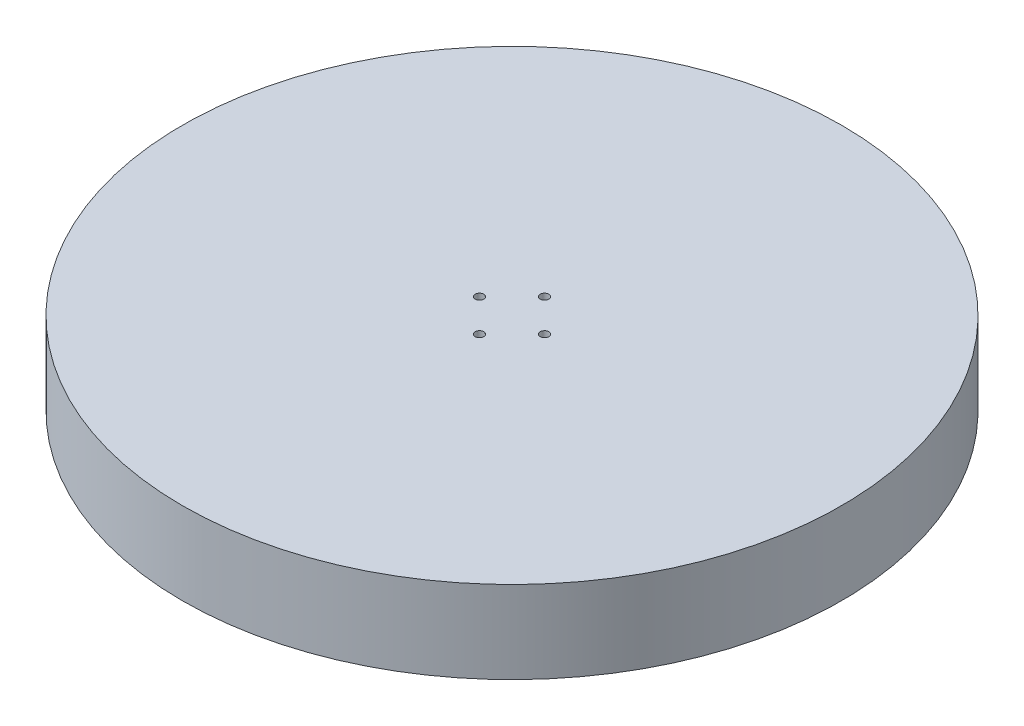
ISO-10303-21;
HEADER;
FILE_DESCRIPTION(('STEP AP214'),'2;1');
FILE_NAME('part.step','',(''),(''),'','','');
FILE_SCHEMA(('AUTOMOTIVE_DESIGN { 1 0 10303 214 1 1 1 1 }'));
ENDSEC;
DATA;
#1=APPLICATION_CONTEXT('core data for automotive mechanical design processes');
#2=APPLICATION_PROTOCOL_DEFINITION('international standard','automotive_design',2000,#1);
#3=PRODUCT_CONTEXT('',#1,'mechanical');
#4=PRODUCT('Part','Part','',(#3));
#5=PRODUCT_RELATED_PRODUCT_CATEGORY('part','',(#4));
#6=PRODUCT_DEFINITION_FORMATION('','',#4);
#7=PRODUCT_DEFINITION_CONTEXT('part definition',#1,'design');
#8=PRODUCT_DEFINITION('design','',#6,#7);
#9=PRODUCT_DEFINITION_SHAPE('','',#8);
#10=(LENGTH_UNIT() NAMED_UNIT(*) SI_UNIT(.MILLI.,.METRE.));
#11=(NAMED_UNIT(*) PLANE_ANGLE_UNIT() SI_UNIT($,.RADIAN.));
#12=(NAMED_UNIT(*) SI_UNIT($,.STERADIAN.) SOLID_ANGLE_UNIT());
#13=UNCERTAINTY_MEASURE_WITH_UNIT(LENGTH_MEASURE(1.E-05),#10,'distance_accuracy_value','');
#14=(GEOMETRIC_REPRESENTATION_CONTEXT(3) GLOBAL_UNCERTAINTY_ASSIGNED_CONTEXT((#13)) GLOBAL_UNIT_ASSIGNED_CONTEXT((#10,
#11,#12)) REPRESENTATION_CONTEXT('',''));
#15=CARTESIAN_POINT('',(0.,0.,0.));
#16=DIRECTION('',(0.,0.,1.));
#17=DIRECTION('',(1.,0.,0.));
#18=AXIS2_PLACEMENT_3D('',#15,#16,#17);
#19=CARTESIAN_POINT('',(0.,4.,0.));
#20=DIRECTION('',(0.,1.,0.));
#21=DIRECTION('',(0.,0.,1.));
#22=AXIS2_PLACEMENT_3D('',#19,#20,#21);
#23=PLANE('',#22);
#24=CARTESIAN_POINT('',(15.0000000000004,4.,4.24488671257339E-13));
#25=DIRECTION('',(0.,1.,0.));
#26=DIRECTION('',(0.,0.,1.));
#27=AXIS2_PLACEMENT_3D('',#24,#25,#26);
#28=CIRCLE('',#27,2.00000000000033);
#29=CARTESIAN_POINT('',(15.0000000000004,4.,2.00000000000076));
#30=VERTEX_POINT('',#29);
#31=EDGE_CURVE('E127',#30,#30,#28,.T.);
#32=ORIENTED_EDGE('',*,*,#31,.F.);
#33=EDGE_LOOP('',(#32));
#34=FACE_BOUND('',#33,.T.);
#35=CARTESIAN_POINT('',(8.48977342514678E-13,4.,-15.));
#36=DIRECTION('',(0.,1.,0.));
#37=DIRECTION('',(0.,0.,1.));
#38=AXIS2_PLACEMENT_3D('',#35,#36,#37);
#39=CIRCLE('',#38,2.00000000000091);
#40=CARTESIAN_POINT('',(8.48977342514678E-13,4.,-12.9999999999991));
#41=VERTEX_POINT('',#40);
#42=EDGE_CURVE('E121',#41,#41,#39,.T.);
#43=ORIENTED_EDGE('',*,*,#42,.F.);
#44=EDGE_LOOP('',(#43));
#45=FACE_BOUND('',#44,.T.);
#46=CARTESIAN_POINT('',(-14.9999999999996,4.,-4.2632564145606E-13));
#47=DIRECTION('',(0.,1.,0.));
#48=DIRECTION('',(0.,0.,1.));
#49=AXIS2_PLACEMENT_3D('',#46,#47,#48);
#50=CIRCLE('',#49,2.00000000000068);
#51=CARTESIAN_POINT('',(-14.9999999999996,4.,2.00000000000026));
#52=VERTEX_POINT('',#51);
#53=EDGE_CURVE('E114',#52,#52,#50,.T.);
#54=ORIENTED_EDGE('',*,*,#53,.F.);
#55=EDGE_LOOP('',(#54));
#56=FACE_BOUND('',#55,.T.);
#57=CARTESIAN_POINT('',(0.,4.,15.));
#58=DIRECTION('',(0.,1.,0.));
#59=DIRECTION('',(0.,0.,1.));
#60=AXIS2_PLACEMENT_3D('',#57,#58,#59);
#61=CIRCLE('',#60,2.);
#62=CARTESIAN_POINT('',(0.,4.,17.));
#63=VERTEX_POINT('',#62);
#64=EDGE_CURVE('E137',#63,#63,#61,.T.);
#65=ORIENTED_EDGE('',*,*,#64,.F.);
#66=EDGE_LOOP('',(#65));
#67=FACE_BOUND('',#66,.T.);
#68=CARTESIAN_POINT('',(-85.7382995761183,4.,2.43682903760944E-12));
#69=DIRECTION('',(0.,1.,0.));
#70=DIRECTION('',(0.,0.,1.));
#71=AXIS2_PLACEMENT_3D('',#68,#69,#70);
#72=CIRCLE('',#71,15.0000000000039);
#73=CARTESIAN_POINT('',(-85.7382995761183,4.,15.0000000000063));
#74=VERTEX_POINT('',#73);
#75=EDGE_CURVE('E142',#74,#74,#72,.T.);
#76=ORIENTED_EDGE('',*,*,#75,.F.);
#77=EDGE_LOOP('',(#76));
#78=FACE_BOUND('',#77,.T.);
#79=CARTESIAN_POINT('',(4.85265824839082E-12,4.,85.7382995761208));
#80=DIRECTION('',(0.,1.,0.));
#81=DIRECTION('',(0.,0.,1.));
#82=AXIS2_PLACEMENT_3D('',#79,#80,#81);
#83=CIRCLE('',#82,15.0000000000052);
#84=CARTESIAN_POINT('',(4.85265824839082E-12,4.,100.738299576126));
#85=VERTEX_POINT('',#84);
#86=EDGE_CURVE('E146',#85,#85,#83,.T.);
#87=ORIENTED_EDGE('',*,*,#86,.F.);
#88=EDGE_LOOP('',(#87));
#89=FACE_BOUND('',#88,.T.);
#90=CARTESIAN_POINT('',(85.7382995761232,4.,-2.42632912419541E-12));
#91=DIRECTION('',(0.,1.,0.));
#92=DIRECTION('',(0.,0.,1.));
#93=AXIS2_PLACEMENT_3D('',#90,#91,#92);
#94=CIRCLE('',#93,15.0000000000019);
#95=CARTESIAN_POINT('',(85.7382995761232,4.,14.9999999999995));
#96=VERTEX_POINT('',#95);
#97=EDGE_CURVE('E152',#96,#96,#94,.T.);
#98=ORIENTED_EDGE('',*,*,#97,.F.);
#99=EDGE_LOOP('',(#98));
#100=FACE_BOUND('',#99,.T.);
#101=CARTESIAN_POINT('',(0.,4.,-85.7382995761208));
#102=DIRECTION('',(0.,1.,0.));
#103=DIRECTION('',(0.,0.,1.));
#104=AXIS2_PLACEMENT_3D('',#101,#102,#103);
#105=CIRCLE('',#104,15.);
#106=CARTESIAN_POINT('',(0.,4.,-70.7382995761208));
#107=VERTEX_POINT('',#106);
#108=EDGE_CURVE('E158',#107,#107,#105,.T.);
#109=ORIENTED_EDGE('',*,*,#108,.F.);
#110=EDGE_LOOP('',(#109));
#111=FACE_BOUND('',#110,.T.);
#112=CARTESIAN_POINT('',(0.,4.,0.));
#113=DIRECTION('',(0.,1.,0.));
#114=DIRECTION('',(0.,0.,1.));
#115=AXIS2_PLACEMENT_3D('',#112,#113,#114);
#116=CIRCLE('',#115,150.);
#117=CARTESIAN_POINT('',(0.,4.,150.));
#118=VERTEX_POINT('',#117);
#119=EDGE_CURVE('E13',#118,#118,#116,.T.);
#120=ORIENTED_EDGE('',*,*,#119,.T.);
#121=EDGE_LOOP('',(#120));
#122=FACE_BOUND('',#121,.T.);
#123=ADVANCED_FACE('F48',(#34,#45,#56,#67,#78,#89,#100,#111,#122),#23,.T.);
#124=CARTESIAN_POINT('',(0.,0.,0.));
#125=DIRECTION('',(0.,1.,0.));
#126=DIRECTION('',(0.,0.,1.));
#127=AXIS2_PLACEMENT_3D('',#124,#125,#126);
#128=PLANE('',#127);
#129=CARTESIAN_POINT('',(15.0000000000004,0.,4.24488671257339E-13));
#130=DIRECTION('',(0.,-1.,0.));
#131=DIRECTION('',(0.,0.,-1.));
#132=AXIS2_PLACEMENT_3D('',#129,#130,#131);
#133=CIRCLE('',#132,2.00000000000033);
#134=CARTESIAN_POINT('',(15.0000000000004,0.,-1.99999999999991));
#135=VERTEX_POINT('',#134);
#136=EDGE_CURVE('E102',#135,#135,#133,.T.);
#137=ORIENTED_EDGE('',*,*,#136,.F.);
#138=EDGE_LOOP('',(#137));
#139=FACE_BOUND('',#138,.T.);
#140=CARTESIAN_POINT('',(8.48977342514678E-13,0.,-15.));
#141=DIRECTION('',(0.,-1.,0.));
#142=DIRECTION('',(0.,0.,-1.));
#143=AXIS2_PLACEMENT_3D('',#140,#141,#142);
#144=CIRCLE('',#143,2.00000000000091);
#145=CARTESIAN_POINT('',(8.48977342514678E-13,0.,-17.0000000000009));
#146=VERTEX_POINT('',#145);
#147=EDGE_CURVE('E106',#146,#146,#144,.T.);
#148=ORIENTED_EDGE('',*,*,#147,.F.);
#149=EDGE_LOOP('',(#148));
#150=FACE_BOUND('',#149,.T.);
#151=CARTESIAN_POINT('',(-14.9999999999996,0.,-4.2632564145606E-13));
#152=DIRECTION('',(0.,-1.,0.));
#153=DIRECTION('',(0.,0.,-1.));
#154=AXIS2_PLACEMENT_3D('',#151,#152,#153);
#155=CIRCLE('',#154,2.00000000000068);
#156=CARTESIAN_POINT('',(-14.9999999999996,0.,-2.00000000000111));
#157=VERTEX_POINT('',#156);
#158=EDGE_CURVE('E101',#157,#157,#155,.T.);
#159=ORIENTED_EDGE('',*,*,#158,.F.);
#160=EDGE_LOOP('',(#159));
#161=FACE_BOUND('',#160,.T.);
#162=CARTESIAN_POINT('',(0.,0.,15.));
#163=DIRECTION('',(0.,-1.,0.));
#164=DIRECTION('',(0.,0.,-1.));
#165=AXIS2_PLACEMENT_3D('',#162,#163,#164);
#166=CIRCLE('',#165,2.);
#167=CARTESIAN_POINT('',(0.,0.,13.));
#168=VERTEX_POINT('',#167);
#169=EDGE_CURVE('E130',#168,#168,#166,.T.);
#170=ORIENTED_EDGE('',*,*,#169,.F.);
#171=EDGE_LOOP('',(#170));
#172=FACE_BOUND('',#171,.T.);
#173=CARTESIAN_POINT('',(0.,0.,0.));
#174=DIRECTION('',(0.,1.,0.));
#175=DIRECTION('',(0.,0.,1.));
#176=AXIS2_PLACEMENT_3D('',#173,#174,#175);
#177=CIRCLE('',#176,152.);
#178=CARTESIAN_POINT('',(0.,0.,152.));
#179=VERTEX_POINT('',#178);
#180=EDGE_CURVE('E87',#179,#179,#177,.T.);
#181=ORIENTED_EDGE('',*,*,#180,.F.);
#182=EDGE_LOOP('',(#181));
#183=FACE_BOUND('',#182,.T.);
#184=ADVANCED_FACE('F50',(#139,#150,#161,#172,#183),#128,.F.);
#185=CARTESIAN_POINT('',(0.,34.,-85.7382995761208));
#186=DIRECTION('',(0.,-1.,0.));
#187=DIRECTION('',(0.,0.,-1.));
#188=AXIS2_PLACEMENT_3D('',#185,#186,#187);
#189=CYLINDRICAL_SURFACE('',#188,15.);
#190=CARTESIAN_POINT('',(0.,34.,-85.7382995761208));
#191=DIRECTION('',(0.,1.,0.));
#192=DIRECTION('',(0.,0.,1.));
#193=AXIS2_PLACEMENT_3D('',#190,#191,#192);
#194=CIRCLE('',#193,15.);
#195=CARTESIAN_POINT('',(0.,34.,-70.7382995761208));
#196=VERTEX_POINT('',#195);
#197=EDGE_CURVE('E57',#196,#196,#194,.T.);
#198=ORIENTED_EDGE('',*,*,#197,.F.);
#199=EDGE_LOOP('',(#198));
#200=FACE_BOUND('',#199,.T.);
#201=ORIENTED_EDGE('',*,*,#108,.T.);
#202=EDGE_LOOP('',(#201));
#203=FACE_BOUND('',#202,.T.);
#204=ADVANCED_FACE('F199',(#200,#203),#189,.T.);
#205=CARTESIAN_POINT('',(85.7382995761232,34.,-2.42632912419541E-12));
#206=DIRECTION('',(0.,-1.,0.));
#207=DIRECTION('',(0.,0.,-1.));
#208=AXIS2_PLACEMENT_3D('',#205,#206,#207);
#209=CYLINDRICAL_SURFACE('',#208,15.0000000000019);
#210=CARTESIAN_POINT('',(85.7382995761232,34.,-2.42632912419541E-12));
#211=DIRECTION('',(0.,1.,0.));
#212=DIRECTION('',(0.,0.,1.));
#213=AXIS2_PLACEMENT_3D('',#210,#211,#212);
#214=CIRCLE('',#213,15.0000000000019);
#215=CARTESIAN_POINT('',(85.7382995761232,34.,14.9999999999995));
#216=VERTEX_POINT('',#215);
#217=EDGE_CURVE('E155',#216,#216,#214,.T.);
#218=ORIENTED_EDGE('',*,*,#217,.F.);
#219=EDGE_LOOP('',(#218));
#220=FACE_BOUND('',#219,.T.);
#221=ORIENTED_EDGE('',*,*,#97,.T.);
#222=EDGE_LOOP('',(#221));
#223=FACE_BOUND('',#222,.T.);
#224=ADVANCED_FACE('F206',(#220,#223),#209,.T.);
#225=CARTESIAN_POINT('',(4.85265824839082E-12,34.,85.7382995761208));
#226=DIRECTION('',(0.,-1.,0.));
#227=DIRECTION('',(0.,0.,-1.));
#228=AXIS2_PLACEMENT_3D('',#225,#226,#227);
#229=CYLINDRICAL_SURFACE('',#228,15.0000000000052);
#230=CARTESIAN_POINT('',(4.85265824839082E-12,34.,85.7382995761208));
#231=DIRECTION('',(0.,1.,0.));
#232=DIRECTION('',(0.,0.,1.));
#233=AXIS2_PLACEMENT_3D('',#230,#231,#232);
#234=CIRCLE('',#233,15.0000000000052);
#235=CARTESIAN_POINT('',(4.85265824839082E-12,34.,100.738299576126));
#236=VERTEX_POINT('',#235);
#237=EDGE_CURVE('E149',#236,#236,#234,.T.);
#238=ORIENTED_EDGE('',*,*,#237,.F.);
#239=EDGE_LOOP('',(#238));
#240=FACE_BOUND('',#239,.T.);
#241=ORIENTED_EDGE('',*,*,#86,.T.);
#242=EDGE_LOOP('',(#241));
#243=FACE_BOUND('',#242,.T.);
#244=ADVANCED_FACE('F210',(#240,#243),#229,.T.);
#245=CARTESIAN_POINT('',(-85.7382995761183,34.,2.43682903760944E-12));
#246=DIRECTION('',(0.,-1.,0.));
#247=DIRECTION('',(0.,0.,-1.));
#248=AXIS2_PLACEMENT_3D('',#245,#246,#247);
#249=CYLINDRICAL_SURFACE('',#248,15.0000000000039);
#250=CARTESIAN_POINT('',(-85.7382995761183,34.,2.43682903760944E-12));
#251=DIRECTION('',(0.,1.,0.));
#252=DIRECTION('',(0.,0.,1.));
#253=AXIS2_PLACEMENT_3D('',#250,#251,#252);
#254=CIRCLE('',#253,15.0000000000039);
#255=CARTESIAN_POINT('',(-85.7382995761183,34.,15.0000000000063));
#256=VERTEX_POINT('',#255);
#257=EDGE_CURVE('E143',#256,#256,#254,.T.);
#258=ORIENTED_EDGE('',*,*,#257,.F.);
#259=EDGE_LOOP('',(#258));
#260=FACE_BOUND('',#259,.T.);
#261=ORIENTED_EDGE('',*,*,#75,.T.);
#262=EDGE_LOOP('',(#261));
#263=FACE_BOUND('',#262,.T.);
#264=ADVANCED_FACE('F214',(#260,#263),#249,.T.);
#265=CARTESIAN_POINT('',(0.,38.,0.));
#266=DIRECTION('',(0.,1.,0.));
#267=DIRECTION('',(0.,0.,1.));
#268=AXIS2_PLACEMENT_3D('',#265,#266,#267);
#269=PLANE('',#268);
#270=CARTESIAN_POINT('',(15.0000000000004,38.,4.24488671257339E-13));
#271=DIRECTION('',(0.,1.,0.));
#272=DIRECTION('',(0.,0.,1.));
#273=AXIS2_PLACEMENT_3D('',#270,#271,#272);
#274=CIRCLE('',#273,2.00000000000033);
#275=CARTESIAN_POINT('',(15.0000000000004,38.,2.00000000000076));
#276=VERTEX_POINT('',#275);
#277=EDGE_CURVE('E124',#276,#276,#274,.T.);
#278=ORIENTED_EDGE('',*,*,#277,.F.);
#279=EDGE_LOOP('',(#278));
#280=FACE_BOUND('',#279,.T.);
#281=CARTESIAN_POINT('',(8.48977342514678E-13,38.,-15.));
#282=DIRECTION('',(0.,1.,0.));
#283=DIRECTION('',(0.,0.,1.));
#284=AXIS2_PLACEMENT_3D('',#281,#282,#283);
#285=CIRCLE('',#284,2.00000000000091);
#286=CARTESIAN_POINT('',(8.48977342514678E-13,38.,-12.9999999999991));
#287=VERTEX_POINT('',#286);
#288=EDGE_CURVE('E118',#287,#287,#285,.T.);
#289=ORIENTED_EDGE('',*,*,#288,.F.);
#290=EDGE_LOOP('',(#289));
#291=FACE_BOUND('',#290,.T.);
#292=CARTESIAN_POINT('',(-14.9999999999996,38.,-4.2632564145606E-13));
#293=DIRECTION('',(0.,1.,0.));
#294=DIRECTION('',(0.,0.,1.));
#295=AXIS2_PLACEMENT_3D('',#292,#293,#294);
#296=CIRCLE('',#295,2.00000000000068);
#297=CARTESIAN_POINT('',(-14.9999999999996,38.,2.00000000000026));
#298=VERTEX_POINT('',#297);
#299=EDGE_CURVE('E111',#298,#298,#296,.T.);
#300=ORIENTED_EDGE('',*,*,#299,.F.);
#301=EDGE_LOOP('',(#300));
#302=FACE_BOUND('',#301,.T.);
#303=CARTESIAN_POINT('',(0.,38.,15.));
#304=DIRECTION('',(0.,1.,0.));
#305=DIRECTION('',(0.,0.,1.));
#306=AXIS2_PLACEMENT_3D('',#303,#304,#305);
#307=CIRCLE('',#306,2.);
#308=CARTESIAN_POINT('',(0.,38.,17.));
#309=VERTEX_POINT('',#308);
#310=EDGE_CURVE('E134',#309,#309,#307,.T.);
#311=ORIENTED_EDGE('',*,*,#310,.F.);
#312=EDGE_LOOP('',(#311));
#313=FACE_BOUND('',#312,.T.);
#314=CARTESIAN_POINT('',(0.,38.,0.));
#315=DIRECTION('',(0.,1.,0.));
#316=DIRECTION('',(0.,0.,1.));
#317=AXIS2_PLACEMENT_3D('',#314,#315,#316);
#318=CIRCLE('',#317,152.);
#319=CARTESIAN_POINT('',(0.,38.,152.));
#320=VERTEX_POINT('',#319);
#321=EDGE_CURVE('E88',#320,#320,#318,.T.);
#322=ORIENTED_EDGE('',*,*,#321,.T.);
#323=EDGE_LOOP('',(#322));
#324=FACE_BOUND('',#323,.T.);
#325=ADVANCED_FACE('F218',(#280,#291,#302,#313,#324),#269,.T.);
#326=CARTESIAN_POINT('',(0.,34.,0.));
#327=DIRECTION('',(0.,1.,0.));
#328=DIRECTION('',(0.,0.,1.));
#329=AXIS2_PLACEMENT_3D('',#326,#327,#328);
#330=PLANE('',#329);
#331=CARTESIAN_POINT('',(15.0000000000004,34.,4.24488671257339E-13));
#332=DIRECTION('',(0.,1.,0.));
#333=DIRECTION('',(0.,0.,1.));
#334=AXIS2_PLACEMENT_3D('',#331,#332,#333);
#335=CIRCLE('',#334,2.00000000000033);
#336=CARTESIAN_POINT('',(15.0000000000004,34.,2.00000000000076));
#337=VERTEX_POINT('',#336);
#338=EDGE_CURVE('E95',#337,#337,#335,.T.);
#339=ORIENTED_EDGE('',*,*,#338,.T.);
#340=EDGE_LOOP('',(#339));
#341=FACE_BOUND('',#340,.T.);
#342=CARTESIAN_POINT('',(8.48977342514678E-13,34.,-15.));
#343=DIRECTION('',(0.,1.,0.));
#344=DIRECTION('',(0.,0.,1.));
#345=AXIS2_PLACEMENT_3D('',#342,#343,#344);
#346=CIRCLE('',#345,2.00000000000091);
#347=CARTESIAN_POINT('',(8.48977342514678E-13,34.,-12.9999999999991));
#348=VERTEX_POINT('',#347);
#349=EDGE_CURVE('E117',#348,#348,#346,.T.);
#350=ORIENTED_EDGE('',*,*,#349,.T.);
#351=EDGE_LOOP('',(#350));
#352=FACE_BOUND('',#351,.T.);
#353=CARTESIAN_POINT('',(-14.9999999999996,34.,-4.2632564145606E-13));
#354=DIRECTION('',(0.,1.,0.));
#355=DIRECTION('',(0.,0.,1.));
#356=AXIS2_PLACEMENT_3D('',#353,#354,#355);
#357=CIRCLE('',#356,2.00000000000068);
#358=CARTESIAN_POINT('',(-14.9999999999996,34.,2.00000000000026));
#359=VERTEX_POINT('',#358);
#360=EDGE_CURVE('E105',#359,#359,#357,.T.);
#361=ORIENTED_EDGE('',*,*,#360,.T.);
#362=EDGE_LOOP('',(#361));
#363=FACE_BOUND('',#362,.T.);
#364=CARTESIAN_POINT('',(0.,34.,15.));
#365=DIRECTION('',(0.,1.,0.));
#366=DIRECTION('',(0.,0.,1.));
#367=AXIS2_PLACEMENT_3D('',#364,#365,#366);
#368=CIRCLE('',#367,2.);
#369=CARTESIAN_POINT('',(0.,34.,17.));
#370=VERTEX_POINT('',#369);
#371=EDGE_CURVE('E133',#370,#370,#368,.T.);
#372=ORIENTED_EDGE('',*,*,#371,.T.);
#373=EDGE_LOOP('',(#372));
#374=FACE_BOUND('',#373,.T.);
#375=ORIENTED_EDGE('',*,*,#197,.T.);
#376=EDGE_LOOP('',(#375));
#377=FACE_BOUND('',#376,.T.);
#378=ORIENTED_EDGE('',*,*,#217,.T.);
#379=EDGE_LOOP('',(#378));
#380=FACE_BOUND('',#379,.T.);
#381=ORIENTED_EDGE('',*,*,#237,.T.);
#382=EDGE_LOOP('',(#381));
#383=FACE_BOUND('',#382,.T.);
#384=ORIENTED_EDGE('',*,*,#257,.T.);
#385=EDGE_LOOP('',(#384));
#386=FACE_BOUND('',#385,.T.);
#387=CARTESIAN_POINT('',(0.,34.,0.));
#388=DIRECTION('',(0.,1.,0.));
#389=DIRECTION('',(0.,0.,1.));
#390=AXIS2_PLACEMENT_3D('',#387,#388,#389);
#391=CIRCLE('',#390,150.);
#392=CARTESIAN_POINT('',(0.,34.,150.));
#393=VERTEX_POINT('',#392);
#394=EDGE_CURVE('E140',#393,#393,#391,.T.);
#395=ORIENTED_EDGE('',*,*,#394,.F.);
#396=EDGE_LOOP('',(#395));
#397=FACE_BOUND('',#396,.T.);
#398=ADVANCED_FACE('F171',(#341,#352,#363,#374,#377,#380,#383,#386,#397),#330,.F.);
#399=CARTESIAN_POINT('',(0.,53.,15.));
#400=DIRECTION('',(0.,-1.,0.));
#401=DIRECTION('',(0.,0.,-1.));
#402=AXIS2_PLACEMENT_3D('',#399,#400,#401);
#403=CYLINDRICAL_SURFACE('',#402,2.);
#404=ORIENTED_EDGE('',*,*,#310,.T.);
#405=EDGE_LOOP('',(#404));
#406=FACE_BOUND('',#405,.T.);
#407=ORIENTED_EDGE('',*,*,#371,.F.);
#408=EDGE_LOOP('',(#407));
#409=FACE_BOUND('',#408,.T.);
#410=ADVANCED_FACE('F222',(#406,#409),#403,.F.);
#411=ORIENTED_EDGE('',*,*,#64,.T.);
#412=EDGE_LOOP('',(#411));
#413=FACE_BOUND('',#412,.T.);
#414=ORIENTED_EDGE('',*,*,#169,.T.);
#415=EDGE_LOOP('',(#414));
#416=FACE_BOUND('',#415,.T.);
#417=ADVANCED_FACE('F189',(#413,#416),#403,.F.);
#418=CARTESIAN_POINT('',(-14.9999999999996,53.,-4.2632564145606E-13));
#419=DIRECTION('',(0.,-1.,0.));
#420=DIRECTION('',(0.,0.,-1.));
#421=AXIS2_PLACEMENT_3D('',#418,#419,#420);
#422=CYLINDRICAL_SURFACE('',#421,2.00000000000068);
#423=ORIENTED_EDGE('',*,*,#299,.T.);
#424=EDGE_LOOP('',(#423));
#425=FACE_BOUND('',#424,.T.);
#426=ORIENTED_EDGE('',*,*,#360,.F.);
#427=EDGE_LOOP('',(#426));
#428=FACE_BOUND('',#427,.T.);
#429=ADVANCED_FACE('F177',(#425,#428),#422,.F.);
#430=CARTESIAN_POINT('',(8.48977342514678E-13,53.,-15.));
#431=DIRECTION('',(0.,-1.,0.));
#432=DIRECTION('',(0.,0.,-1.));
#433=AXIS2_PLACEMENT_3D('',#430,#431,#432);
#434=CYLINDRICAL_SURFACE('',#433,2.00000000000091);
#435=ORIENTED_EDGE('',*,*,#288,.T.);
#436=EDGE_LOOP('',(#435));
#437=FACE_BOUND('',#436,.T.);
#438=ORIENTED_EDGE('',*,*,#349,.F.);
#439=EDGE_LOOP('',(#438));
#440=FACE_BOUND('',#439,.T.);
#441=ADVANCED_FACE('F174',(#437,#440),#434,.F.);
#442=CARTESIAN_POINT('',(15.0000000000004,53.,4.24488671257339E-13));
#443=DIRECTION('',(0.,-1.,0.));
#444=DIRECTION('',(0.,0.,-1.));
#445=AXIS2_PLACEMENT_3D('',#442,#443,#444);
#446=CYLINDRICAL_SURFACE('',#445,2.00000000000033);
#447=ORIENTED_EDGE('',*,*,#277,.T.);
#448=EDGE_LOOP('',(#447));
#449=FACE_BOUND('',#448,.T.);
#450=ORIENTED_EDGE('',*,*,#338,.F.);
#451=EDGE_LOOP('',(#450));
#452=FACE_BOUND('',#451,.T.);
#453=ADVANCED_FACE('F176',(#449,#452),#446,.F.);
#454=ORIENTED_EDGE('',*,*,#53,.T.);
#455=EDGE_LOOP('',(#454));
#456=FACE_BOUND('',#455,.T.);
#457=ORIENTED_EDGE('',*,*,#158,.T.);
#458=EDGE_LOOP('',(#457));
#459=FACE_BOUND('',#458,.T.);
#460=ADVANCED_FACE('F185',(#456,#459),#422,.F.);
#461=ORIENTED_EDGE('',*,*,#42,.T.);
#462=EDGE_LOOP('',(#461));
#463=FACE_BOUND('',#462,.T.);
#464=ORIENTED_EDGE('',*,*,#147,.T.);
#465=EDGE_LOOP('',(#464));
#466=FACE_BOUND('',#465,.T.);
#467=ADVANCED_FACE('F180',(#463,#466),#434,.F.);
#468=ORIENTED_EDGE('',*,*,#31,.T.);
#469=EDGE_LOOP('',(#468));
#470=FACE_BOUND('',#469,.T.);
#471=ORIENTED_EDGE('',*,*,#136,.T.);
#472=EDGE_LOOP('',(#471));
#473=FACE_BOUND('',#472,.T.);
#474=ADVANCED_FACE('F188',(#470,#473),#446,.F.);
#475=CARTESIAN_POINT('',(0.,38.,0.));
#476=DIRECTION('',(0.,1.,0.));
#477=DIRECTION('',(0.,0.,1.));
#478=AXIS2_PLACEMENT_3D('',#475,#476,#477);
#479=CYLINDRICAL_SURFACE('',#478,150.);
#480=DIRECTION('',(0.,1.,0.));
#481=VECTOR('',#480,1.);
#482=CARTESIAN_POINT('',(0.,0.,150.));
#483=LINE('',#482,#481);
#484=EDGE_CURVE('E71',#118,#393,#483,.T.);
#485=ORIENTED_EDGE('',*,*,#484,.F.);
#486=ORIENTED_EDGE('',*,*,#119,.F.);
#487=ORIENTED_EDGE('',*,*,#484,.T.);
#488=ORIENTED_EDGE('',*,*,#394,.T.);
#489=EDGE_LOOP('',(#485,#486,#487,#488));
#490=FACE_BOUND('',#489,.T.);
#491=ADVANCED_FACE('F252',(#490),#479,.F.);
#492=CARTESIAN_POINT('',(0.,38.,0.));
#493=DIRECTION('',(0.,1.,0.));
#494=DIRECTION('',(0.,0.,1.));
#495=AXIS2_PLACEMENT_3D('',#492,#493,#494);
#496=CYLINDRICAL_SURFACE('',#495,152.);
#497=DIRECTION('',(0.,-1.,0.));
#498=VECTOR('',#497,1.);
#499=CARTESIAN_POINT('',(0.,0.,152.));
#500=LINE('',#499,#498);
#501=EDGE_CURVE('E89',#320,#179,#500,.T.);
#502=ORIENTED_EDGE('',*,*,#501,.F.);
#503=ORIENTED_EDGE('',*,*,#321,.F.);
#504=ORIENTED_EDGE('',*,*,#501,.T.);
#505=ORIENTED_EDGE('',*,*,#180,.T.);
#506=EDGE_LOOP('',(#502,#503,#504,#505));
#507=FACE_BOUND('',#506,.T.);
#508=ADVANCED_FACE('F254',(#507),#496,.T.);
#509=CLOSED_SHELL('',(#123,#184,#204,#224,#244,#264,#325,#398,#410,#417,#429,#441,#453,#460,
#467,#474,#491,#508));
#510=MANIFOLD_SOLID_BREP('B2',#509);
#511=ADVANCED_BREP_SHAPE_REPRESENTATION('',(#18,#510),#14);
#512=SHAPE_DEFINITION_REPRESENTATION(#9,#511);
ENDSEC;
END-ISO-10303-21;
